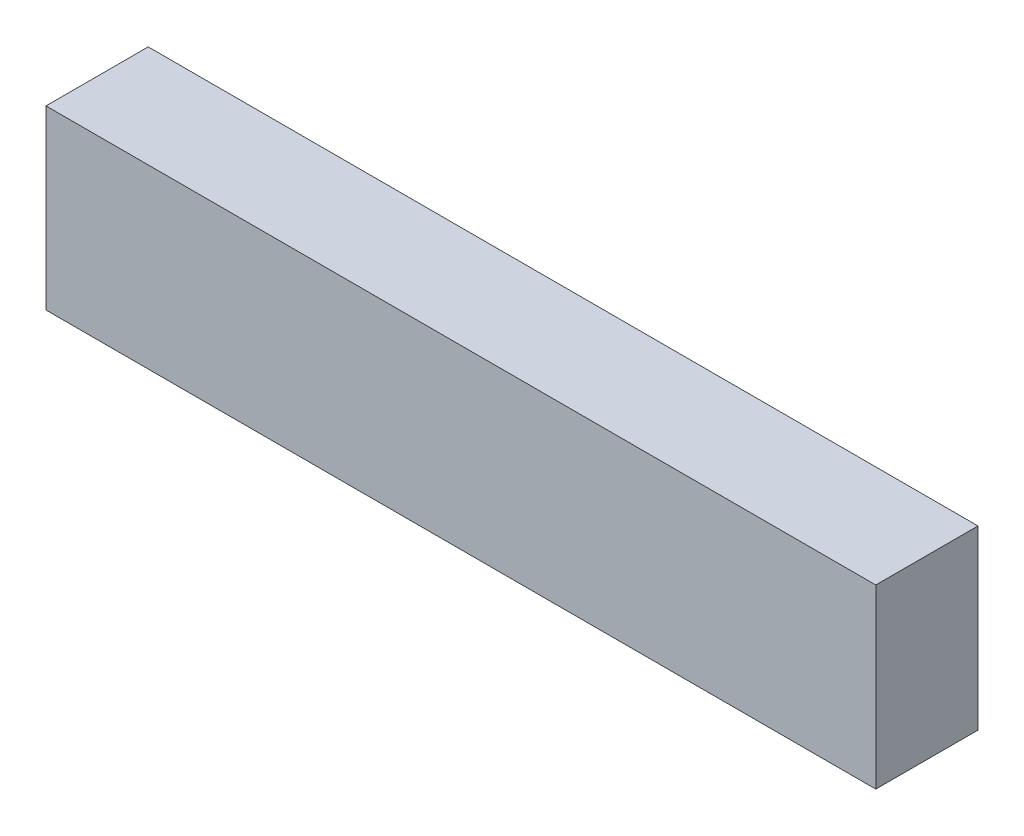
ISO-10303-21;
HEADER;
FILE_DESCRIPTION(('STEP AP214'),'2;1');
FILE_NAME('part.step','',(''),(''),'','','');
FILE_SCHEMA(('AUTOMOTIVE_DESIGN { 1 0 10303 214 1 1 1 1 }'));
ENDSEC;
DATA;
#1=APPLICATION_CONTEXT('core data for automotive mechanical design processes');
#2=APPLICATION_PROTOCOL_DEFINITION('international standard','automotive_design',2000,#1);
#3=PRODUCT_CONTEXT('',#1,'mechanical');
#4=PRODUCT('Part','Part','',(#3));
#5=PRODUCT_RELATED_PRODUCT_CATEGORY('part','',(#4));
#6=PRODUCT_DEFINITION_FORMATION('','',#4);
#7=PRODUCT_DEFINITION_CONTEXT('part definition',#1,'design');
#8=PRODUCT_DEFINITION('design','',#6,#7);
#9=PRODUCT_DEFINITION_SHAPE('','',#8);
#10=(LENGTH_UNIT() NAMED_UNIT(*) SI_UNIT(.MILLI.,.METRE.));
#11=(NAMED_UNIT(*) PLANE_ANGLE_UNIT() SI_UNIT($,.RADIAN.));
#12=(NAMED_UNIT(*) SI_UNIT($,.STERADIAN.) SOLID_ANGLE_UNIT());
#13=UNCERTAINTY_MEASURE_WITH_UNIT(LENGTH_MEASURE(1.E-05),#10,'distance_accuracy_value','');
#14=(GEOMETRIC_REPRESENTATION_CONTEXT(3) GLOBAL_UNCERTAINTY_ASSIGNED_CONTEXT((#13)) GLOBAL_UNIT_ASSIGNED_CONTEXT((#10,
#11,#12)) REPRESENTATION_CONTEXT('',''));
#15=CARTESIAN_POINT('',(0.,0.,0.));
#16=DIRECTION('',(0.,0.,1.));
#17=DIRECTION('',(1.,0.,0.));
#18=AXIS2_PLACEMENT_3D('',#15,#16,#17);
#19=CARTESIAN_POINT('',(20.1845000000004,14.25,7.25));
#20=DIRECTION('',(1.,0.,0.));
#21=DIRECTION('',(0.,0.,-1.));
#22=AXIS2_PLACEMENT_3D('',#19,#20,#21);
#23=PLANE('',#22);
#24=DIRECTION('',(0.,-1.,0.));
#25=VECTOR('',#24,1.);
#26=CARTESIAN_POINT('',(20.1845000000004,14.25,0.));
#27=LINE('',#26,#25);
#28=CARTESIAN_POINT('',(20.1845000000004,14.25,0.));
#29=VERTEX_POINT('',#28);
#30=CARTESIAN_POINT('',(20.1845000000004,1.71000000000001,0.));
#31=VERTEX_POINT('',#30);
#32=EDGE_CURVE('E128',#29,#31,#27,.T.);
#33=ORIENTED_EDGE('',*,*,#32,.T.);
#34=DIRECTION('',(0.,0.,-1.));
#35=VECTOR('',#34,1.);
#36=CARTESIAN_POINT('',(20.1845000000004,1.71000000000001,7.25));
#37=LINE('',#36,#35);
#38=CARTESIAN_POINT('',(20.1845000000004,1.71000000000001,7.25));
#39=VERTEX_POINT('',#38);
#40=EDGE_CURVE('E11',#39,#31,#37,.T.);
#41=ORIENTED_EDGE('',*,*,#40,.F.);
#42=DIRECTION('',(0.,-1.,0.));
#43=VECTOR('',#42,1.);
#44=CARTESIAN_POINT('',(20.1845000000004,14.25,7.25));
#45=LINE('',#44,#43);
#46=CARTESIAN_POINT('',(20.1845000000004,14.25,7.25));
#47=VERTEX_POINT('',#46);
#48=EDGE_CURVE('E148',#47,#39,#45,.T.);
#49=ORIENTED_EDGE('',*,*,#48,.F.);
#50=DIRECTION('',(0.,0.,-1.));
#51=VECTOR('',#50,1.);
#52=CARTESIAN_POINT('',(20.1845000000004,14.25,7.25));
#53=LINE('',#52,#51);
#54=EDGE_CURVE('E153',#47,#29,#53,.T.);
#55=ORIENTED_EDGE('',*,*,#54,.T.);
#56=EDGE_LOOP('',(#33,#41,#49,#55));
#57=FACE_BOUND('',#56,.T.);
#58=ADVANCED_FACE('F32',(#57),#23,.F.);
#59=CARTESIAN_POINT('',(20.1845000000004,1.71000000000001,7.25));
#60=DIRECTION('',(0.,1.,0.));
#61=DIRECTION('',(0.,0.,1.));
#62=AXIS2_PLACEMENT_3D('',#59,#60,#61);
#63=PLANE('',#62);
#64=DIRECTION('',(1.,0.,0.));
#65=VECTOR('',#64,1.);
#66=CARTESIAN_POINT('',(20.1845000000004,1.71000000000001,0.));
#67=LINE('',#66,#65);
#68=CARTESIAN_POINT('',(79.0368014902547,1.71000000000001,0.));
#69=VERTEX_POINT('',#68);
#70=EDGE_CURVE('E132',#31,#69,#67,.T.);
#71=ORIENTED_EDGE('',*,*,#70,.T.);
#72=DIRECTION('',(0.,0.,-1.));
#73=VECTOR('',#72,1.);
#74=CARTESIAN_POINT('',(79.0368014902547,1.71000000000001,7.25));
#75=LINE('',#74,#73);
#76=CARTESIAN_POINT('',(79.0368014902547,1.71000000000001,7.25));
#77=VERTEX_POINT('',#76);
#78=EDGE_CURVE('E39',#77,#69,#75,.T.);
#79=ORIENTED_EDGE('',*,*,#78,.F.);
#80=DIRECTION('',(1.,0.,0.));
#81=VECTOR('',#80,1.);
#82=CARTESIAN_POINT('',(20.1845000000004,1.71000000000001,7.25));
#83=LINE('',#82,#81);
#84=EDGE_CURVE('E83',#39,#77,#83,.T.);
#85=ORIENTED_EDGE('',*,*,#84,.F.);
#86=ORIENTED_EDGE('',*,*,#40,.T.);
#87=EDGE_LOOP('',(#71,#79,#85,#86));
#88=FACE_BOUND('',#87,.T.);
#89=ADVANCED_FACE('F182',(#88),#63,.F.);
#90=CARTESIAN_POINT('',(79.0368014902547,14.25,7.25));
#91=DIRECTION('',(-1.,0.,0.));
#92=DIRECTION('',(0.,0.,1.));
#93=AXIS2_PLACEMENT_3D('',#90,#91,#92);
#94=PLANE('',#93);
#95=DIRECTION('',(0.,1.,0.));
#96=VECTOR('',#95,1.);
#97=CARTESIAN_POINT('',(79.0368014902547,14.25,0.));
#98=LINE('',#97,#96);
#99=CARTESIAN_POINT('',(79.0368014902547,14.25,0.));
#100=VERTEX_POINT('',#99);
#101=EDGE_CURVE('E156',#69,#100,#98,.T.);
#102=ORIENTED_EDGE('',*,*,#101,.T.);
#103=DIRECTION('',(0.,0.,-1.));
#104=VECTOR('',#103,1.);
#105=CARTESIAN_POINT('',(79.0368014902547,14.25,7.25));
#106=LINE('',#105,#104);
#107=CARTESIAN_POINT('',(79.0368014902547,14.25,7.25));
#108=VERTEX_POINT('',#107);
#109=EDGE_CURVE('E160',#108,#100,#106,.T.);
#110=ORIENTED_EDGE('',*,*,#109,.F.);
#111=DIRECTION('',(0.,1.,0.));
#112=VECTOR('',#111,1.);
#113=CARTESIAN_POINT('',(79.0368014902547,14.25,7.25));
#114=LINE('',#113,#112);
#115=EDGE_CURVE('E151',#77,#108,#114,.T.);
#116=ORIENTED_EDGE('',*,*,#115,.F.);
#117=ORIENTED_EDGE('',*,*,#78,.T.);
#118=EDGE_LOOP('',(#102,#110,#116,#117));
#119=FACE_BOUND('',#118,.T.);
#120=ADVANCED_FACE('F165',(#119),#94,.F.);
#121=CARTESIAN_POINT('',(20.1845000000004,14.25,7.25));
#122=DIRECTION('',(0.,-1.,0.));
#123=DIRECTION('',(0.,0.,-1.));
#124=AXIS2_PLACEMENT_3D('',#121,#122,#123);
#125=PLANE('',#124);
#126=DIRECTION('',(-1.,0.,0.));
#127=VECTOR('',#126,1.);
#128=CARTESIAN_POINT('',(20.1845000000004,14.25,0.));
#129=LINE('',#128,#127);
#130=EDGE_CURVE('E76',#100,#29,#129,.T.);
#131=ORIENTED_EDGE('',*,*,#130,.T.);
#132=ORIENTED_EDGE('',*,*,#54,.F.);
#133=DIRECTION('',(-1.,0.,0.));
#134=VECTOR('',#133,1.);
#135=CARTESIAN_POINT('',(20.1845000000004,14.25,7.25));
#136=LINE('',#135,#134);
#137=EDGE_CURVE('E55',#108,#47,#136,.T.);
#138=ORIENTED_EDGE('',*,*,#137,.F.);
#139=ORIENTED_EDGE('',*,*,#109,.T.);
#140=EDGE_LOOP('',(#131,#132,#138,#139));
#141=FACE_BOUND('',#140,.T.);
#142=ADVANCED_FACE('F173',(#141),#125,.F.);
#143=CARTESIAN_POINT('',(0.,0.,7.25));
#144=DIRECTION('',(0.,0.,1.));
#145=DIRECTION('',(1.,0.,0.));
#146=AXIS2_PLACEMENT_3D('',#143,#144,#145);
#147=PLANE('',#146);
#148=ORIENTED_EDGE('',*,*,#48,.T.);
#149=ORIENTED_EDGE('',*,*,#84,.T.);
#150=ORIENTED_EDGE('',*,*,#115,.T.);
#151=ORIENTED_EDGE('',*,*,#137,.T.);
#152=EDGE_LOOP('',(#148,#149,#150,#151));
#153=FACE_BOUND('',#152,.T.);
#154=ADVANCED_FACE('F175',(#153),#147,.T.);
#155=CARTESIAN_POINT('',(0.,0.,0.));
#156=DIRECTION('',(0.,0.,1.));
#157=DIRECTION('',(1.,0.,0.));
#158=AXIS2_PLACEMENT_3D('',#155,#156,#157);
#159=PLANE('',#158);
#160=DIRECTION('',(-1.,0.,0.));
#161=VECTOR('',#160,1.);
#162=CARTESIAN_POINT('',(20.1845000000004,13.75,0.));
#163=LINE('',#162,#161);
#164=CARTESIAN_POINT('',(78.5368014902547,13.75,0.));
#165=VERTEX_POINT('',#164);
#166=CARTESIAN_POINT('',(20.6845000000004,13.75,0.));
#167=VERTEX_POINT('',#166);
#168=EDGE_CURVE('E123',#165,#167,#163,.T.);
#169=ORIENTED_EDGE('',*,*,#168,.T.);
#170=DIRECTION('',(0.,-1.,0.));
#171=VECTOR('',#170,1.);
#172=CARTESIAN_POINT('',(20.6845000000004,14.25,0.));
#173=LINE('',#172,#171);
#174=CARTESIAN_POINT('',(20.6845000000004,2.21000000000001,0.));
#175=VERTEX_POINT('',#174);
#176=EDGE_CURVE('E142',#167,#175,#173,.T.);
#177=ORIENTED_EDGE('',*,*,#176,.T.);
#178=DIRECTION('',(1.,0.,0.));
#179=VECTOR('',#178,1.);
#180=CARTESIAN_POINT('',(20.1845000000004,2.21000000000001,0.));
#181=LINE('',#180,#179);
#182=CARTESIAN_POINT('',(78.5368014902547,2.21000000000001,0.));
#183=VERTEX_POINT('',#182);
#184=EDGE_CURVE('E127',#175,#183,#181,.T.);
#185=ORIENTED_EDGE('',*,*,#184,.T.);
#186=DIRECTION('',(0.,1.,0.));
#187=VECTOR('',#186,1.);
#188=CARTESIAN_POINT('',(78.5368014902547,14.25,0.));
#189=LINE('',#188,#187);
#190=EDGE_CURVE('E46',#183,#165,#189,.T.);
#191=ORIENTED_EDGE('',*,*,#190,.T.);
#192=EDGE_LOOP('',(#169,#177,#185,#191));
#193=FACE_BOUND('',#192,.T.);
#194=ORIENTED_EDGE('',*,*,#32,.F.);
#195=ORIENTED_EDGE('',*,*,#130,.F.);
#196=ORIENTED_EDGE('',*,*,#101,.F.);
#197=ORIENTED_EDGE('',*,*,#70,.F.);
#198=EDGE_LOOP('',(#194,#195,#196,#197));
#199=FACE_BOUND('',#198,.T.);
#200=ADVANCED_FACE('F169',(#193,#199),#159,.F.);
#201=CARTESIAN_POINT('',(20.6845000000004,14.25,7.25));
#202=DIRECTION('',(1.,0.,0.));
#203=DIRECTION('',(0.,0.,-1.));
#204=AXIS2_PLACEMENT_3D('',#201,#202,#203);
#205=PLANE('',#204);
#206=ORIENTED_EDGE('',*,*,#176,.F.);
#207=DIRECTION('',(0.,0.,-1.));
#208=VECTOR('',#207,1.);
#209=CARTESIAN_POINT('',(20.6845000000004,13.75,7.25));
#210=LINE('',#209,#208);
#211=CARTESIAN_POINT('',(20.6845000000004,13.75,7.05));
#212=VERTEX_POINT('',#211);
#213=EDGE_CURVE('E122',#212,#167,#210,.T.);
#214=ORIENTED_EDGE('',*,*,#213,.F.);
#215=DIRECTION('',(0.,-1.,0.));
#216=VECTOR('',#215,1.);
#217=CARTESIAN_POINT('',(20.6845000000004,14.25,7.05));
#218=LINE('',#217,#216);
#219=CARTESIAN_POINT('',(20.6845000000004,2.21000000000001,7.05));
#220=VERTEX_POINT('',#219);
#221=EDGE_CURVE('E110',#212,#220,#218,.T.);
#222=ORIENTED_EDGE('',*,*,#221,.T.);
#223=DIRECTION('',(0.,0.,-1.));
#224=VECTOR('',#223,1.);
#225=CARTESIAN_POINT('',(20.6845000000004,2.21000000000001,7.25));
#226=LINE('',#225,#224);
#227=EDGE_CURVE('E120',#220,#175,#226,.T.);
#228=ORIENTED_EDGE('',*,*,#227,.T.);
#229=EDGE_LOOP('',(#206,#214,#222,#228));
#230=FACE_BOUND('',#229,.T.);
#231=ADVANCED_FACE('F119',(#230),#205,.T.);
#232=CARTESIAN_POINT('',(20.1845000000004,2.21000000000001,7.25));
#233=DIRECTION('',(0.,1.,0.));
#234=DIRECTION('',(0.,0.,1.));
#235=AXIS2_PLACEMENT_3D('',#232,#233,#234);
#236=PLANE('',#235);
#237=ORIENTED_EDGE('',*,*,#184,.F.);
#238=ORIENTED_EDGE('',*,*,#227,.F.);
#239=DIRECTION('',(1.,0.,0.));
#240=VECTOR('',#239,1.);
#241=CARTESIAN_POINT('',(20.1845000000004,2.21000000000001,7.05));
#242=LINE('',#241,#240);
#243=CARTESIAN_POINT('',(78.5368014902547,2.21000000000001,7.05));
#244=VERTEX_POINT('',#243);
#245=EDGE_CURVE('E106',#220,#244,#242,.T.);
#246=ORIENTED_EDGE('',*,*,#245,.T.);
#247=DIRECTION('',(0.,0.,-1.));
#248=VECTOR('',#247,1.);
#249=CARTESIAN_POINT('',(78.5368014902547,2.21000000000001,7.25));
#250=LINE('',#249,#248);
#251=EDGE_CURVE('E129',#244,#183,#250,.T.);
#252=ORIENTED_EDGE('',*,*,#251,.T.);
#253=EDGE_LOOP('',(#237,#238,#246,#252));
#254=FACE_BOUND('',#253,.T.);
#255=ADVANCED_FACE('F125',(#254),#236,.T.);
#256=CARTESIAN_POINT('',(78.5368014902547,14.25,7.25));
#257=DIRECTION('',(-1.,0.,0.));
#258=DIRECTION('',(0.,0.,1.));
#259=AXIS2_PLACEMENT_3D('',#256,#257,#258);
#260=PLANE('',#259);
#261=ORIENTED_EDGE('',*,*,#190,.F.);
#262=ORIENTED_EDGE('',*,*,#251,.F.);
#263=DIRECTION('',(0.,1.,0.));
#264=VECTOR('',#263,1.);
#265=CARTESIAN_POINT('',(78.5368014902547,14.25,7.05));
#266=LINE('',#265,#264);
#267=CARTESIAN_POINT('',(78.5368014902547,13.75,7.05));
#268=VERTEX_POINT('',#267);
#269=EDGE_CURVE('E111',#244,#268,#266,.T.);
#270=ORIENTED_EDGE('',*,*,#269,.T.);
#271=DIRECTION('',(0.,0.,-1.));
#272=VECTOR('',#271,1.);
#273=CARTESIAN_POINT('',(78.5368014902547,13.75,7.25));
#274=LINE('',#273,#272);
#275=EDGE_CURVE('E134',#268,#165,#274,.T.);
#276=ORIENTED_EDGE('',*,*,#275,.T.);
#277=EDGE_LOOP('',(#261,#262,#270,#276));
#278=FACE_BOUND('',#277,.T.);
#279=ADVANCED_FACE('F230',(#278),#260,.T.);
#280=CARTESIAN_POINT('',(20.1845000000004,13.75,7.25));
#281=DIRECTION('',(0.,-1.,0.));
#282=DIRECTION('',(0.,0.,-1.));
#283=AXIS2_PLACEMENT_3D('',#280,#281,#282);
#284=PLANE('',#283);
#285=ORIENTED_EDGE('',*,*,#168,.F.);
#286=ORIENTED_EDGE('',*,*,#275,.F.);
#287=DIRECTION('',(-1.,0.,0.));
#288=VECTOR('',#287,1.);
#289=CARTESIAN_POINT('',(20.1845000000004,13.75,7.05));
#290=LINE('',#289,#288);
#291=EDGE_CURVE('E137',#268,#212,#290,.T.);
#292=ORIENTED_EDGE('',*,*,#291,.T.);
#293=ORIENTED_EDGE('',*,*,#213,.T.);
#294=EDGE_LOOP('',(#285,#286,#292,#293));
#295=FACE_BOUND('',#294,.T.);
#296=ADVANCED_FACE('F239',(#295),#284,.T.);
#297=CARTESIAN_POINT('',(0.,0.,7.05));
#298=DIRECTION('',(0.,0.,1.));
#299=DIRECTION('',(1.,0.,0.));
#300=AXIS2_PLACEMENT_3D('',#297,#298,#299);
#301=PLANE('',#300);
#302=ORIENTED_EDGE('',*,*,#221,.F.);
#303=ORIENTED_EDGE('',*,*,#291,.F.);
#304=ORIENTED_EDGE('',*,*,#269,.F.);
#305=ORIENTED_EDGE('',*,*,#245,.F.);
#306=EDGE_LOOP('',(#302,#303,#304,#305));
#307=FACE_BOUND('',#306,.T.);
#308=ADVANCED_FACE('F108',(#307),#301,.F.);
#309=CLOSED_SHELL('',(#58,#89,#120,#142,#154,#200,#231,#255,#279,#296,#308));
#310=MANIFOLD_SOLID_BREP('B2',#309);
#311=ADVANCED_BREP_SHAPE_REPRESENTATION('',(#18,#310),#14);
#312=SHAPE_DEFINITION_REPRESENTATION(#9,#311);
ENDSEC;
END-ISO-10303-21;
